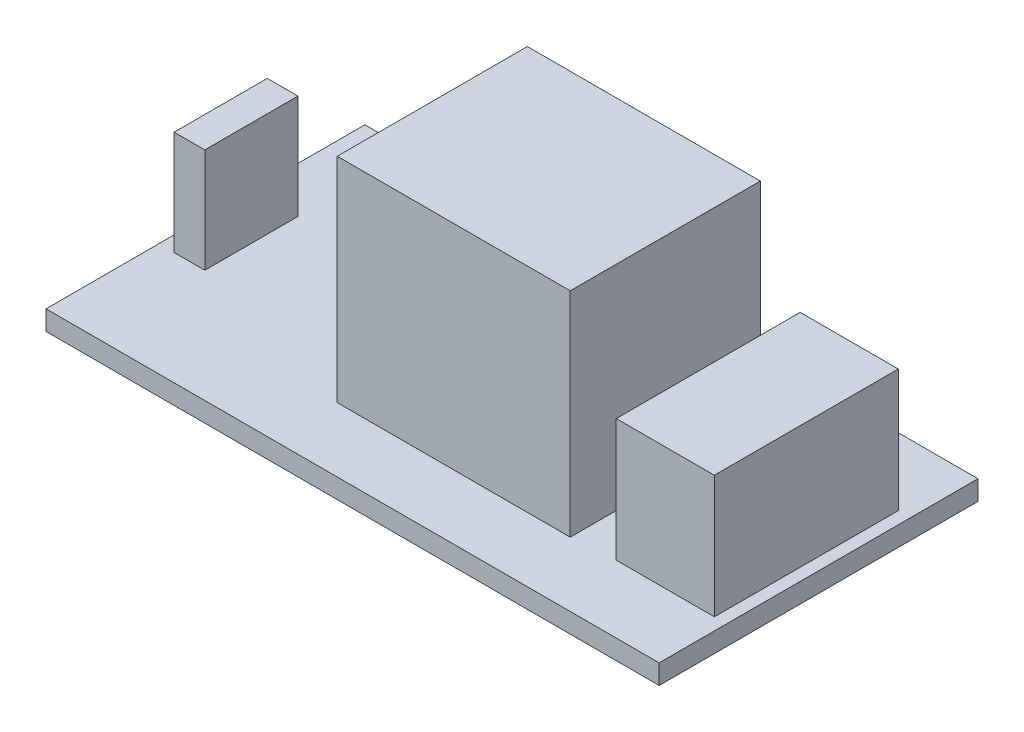
ISO-10303-21;
HEADER;
FILE_DESCRIPTION(('STEP AP214'),'2;1');
FILE_NAME('part.step','',(''),(''),'','','');
FILE_SCHEMA(('AUTOMOTIVE_DESIGN { 1 0 10303 214 1 1 1 1 }'));
ENDSEC;
DATA;
#1=APPLICATION_CONTEXT('core data for automotive mechanical design processes');
#2=APPLICATION_PROTOCOL_DEFINITION('international standard','automotive_design',2000,#1);
#3=PRODUCT_CONTEXT('',#1,'mechanical');
#4=PRODUCT('Part','Part','',(#3));
#5=PRODUCT_RELATED_PRODUCT_CATEGORY('part','',(#4));
#6=PRODUCT_DEFINITION_FORMATION('','',#4);
#7=PRODUCT_DEFINITION_CONTEXT('part definition',#1,'design');
#8=PRODUCT_DEFINITION('design','',#6,#7);
#9=PRODUCT_DEFINITION_SHAPE('','',#8);
#10=(LENGTH_UNIT() NAMED_UNIT(*) SI_UNIT(.MILLI.,.METRE.));
#11=(NAMED_UNIT(*) PLANE_ANGLE_UNIT() SI_UNIT($,.RADIAN.));
#12=(NAMED_UNIT(*) SI_UNIT($,.STERADIAN.) SOLID_ANGLE_UNIT());
#13=UNCERTAINTY_MEASURE_WITH_UNIT(LENGTH_MEASURE(1.E-05),#10,'distance_accuracy_value','');
#14=(GEOMETRIC_REPRESENTATION_CONTEXT(3) GLOBAL_UNCERTAINTY_ASSIGNED_CONTEXT((#13)) GLOBAL_UNIT_ASSIGNED_CONTEXT((#10,
#11,#12)) REPRESENTATION_CONTEXT('',''));
#15=CARTESIAN_POINT('',(0.,0.,0.));
#16=DIRECTION('',(0.,0.,1.));
#17=DIRECTION('',(1.,0.,0.));
#18=AXIS2_PLACEMENT_3D('',#15,#16,#17);
#19=CARTESIAN_POINT('',(0.,1.6,0.));
#20=DIRECTION('',(0.,-1.,0.));
#21=DIRECTION('',(0.,0.,-1.));
#22=AXIS2_PLACEMENT_3D('',#19,#20,#21);
#23=PLANE('',#22);
#24=DIRECTION('',(0.,0.,1.));
#25=VECTOR('',#24,1.);
#26=CARTESIAN_POINT('',(16.,1.6,-7.5));
#27=LINE('',#26,#25);
#28=CARTESIAN_POINT('',(16.,1.6,-7.5));
#29=VERTEX_POINT('',#28);
#30=CARTESIAN_POINT('',(16.,1.6,7.5));
#31=VERTEX_POINT('',#30);
#32=EDGE_CURVE('E182',#29,#31,#27,.T.);
#33=ORIENTED_EDGE('',*,*,#32,.F.);
#34=DIRECTION('',(-1.,0.,0.));
#35=VECTOR('',#34,1.);
#36=CARTESIAN_POINT('',(24.,1.6,-7.5));
#37=LINE('',#36,#35);
#38=CARTESIAN_POINT('',(24.,1.6,-7.5));
#39=VERTEX_POINT('',#38);
#40=EDGE_CURVE('E193',#39,#29,#37,.T.);
#41=ORIENTED_EDGE('',*,*,#40,.F.);
#42=DIRECTION('',(0.,0.,-1.));
#43=VECTOR('',#42,1.);
#44=CARTESIAN_POINT('',(24.,1.6,7.5));
#45=LINE('',#44,#43);
#46=CARTESIAN_POINT('',(24.,1.6,7.5));
#47=VERTEX_POINT('',#46);
#48=EDGE_CURVE('E201',#47,#39,#45,.T.);
#49=ORIENTED_EDGE('',*,*,#48,.F.);
#50=DIRECTION('',(1.,0.,0.));
#51=VECTOR('',#50,1.);
#52=CARTESIAN_POINT('',(16.,1.6,7.5));
#53=LINE('',#52,#51);
#54=EDGE_CURVE('E184',#31,#47,#53,.T.);
#55=ORIENTED_EDGE('',*,*,#54,.F.);
#56=EDGE_LOOP('',(#33,#41,#49,#55));
#57=FACE_BOUND('',#56,.T.);
#58=DIRECTION('',(0.,0.,-1.));
#59=VECTOR('',#58,1.);
#60=CARTESIAN_POINT('',(25.,1.6,13.));
#61=LINE('',#60,#59);
#62=CARTESIAN_POINT('',(25.,1.6,13.));
#63=VERTEX_POINT('',#62);
#64=CARTESIAN_POINT('',(25.,1.6,-13.));
#65=VERTEX_POINT('',#64);
#66=EDGE_CURVE('E251',#63,#65,#61,.T.);
#67=ORIENTED_EDGE('',*,*,#66,.T.);
#68=DIRECTION('',(-1.,0.,0.));
#69=VECTOR('',#68,1.);
#70=CARTESIAN_POINT('',(-25.,1.6,-13.));
#71=LINE('',#70,#69);
#72=CARTESIAN_POINT('',(-25.,1.6,-13.));
#73=VERTEX_POINT('',#72);
#74=EDGE_CURVE('E258',#65,#73,#71,.T.);
#75=ORIENTED_EDGE('',*,*,#74,.T.);
#76=DIRECTION('',(0.,0.,1.));
#77=VECTOR('',#76,1.);
#78=CARTESIAN_POINT('',(-25.,1.6,13.));
#79=LINE('',#78,#77);
#80=CARTESIAN_POINT('',(-25.,1.6,13.));
#81=VERTEX_POINT('',#80);
#82=EDGE_CURVE('E259',#73,#81,#79,.T.);
#83=ORIENTED_EDGE('',*,*,#82,.T.);
#84=DIRECTION('',(1.,0.,0.));
#85=VECTOR('',#84,1.);
#86=CARTESIAN_POINT('',(-25.,1.6,13.));
#87=LINE('',#86,#85);
#88=EDGE_CURVE('E261',#81,#63,#87,.T.);
#89=ORIENTED_EDGE('',*,*,#88,.T.);
#90=EDGE_LOOP('',(#67,#75,#83,#89));
#91=FACE_BOUND('',#90,.T.);
#92=DIRECTION('',(0.,0.,1.));
#93=VECTOR('',#92,1.);
#94=CARTESIAN_POINT('',(-6.5,1.6,-7.75));
#95=LINE('',#94,#93);
#96=CARTESIAN_POINT('',(-6.5,1.6,-7.75));
#97=VERTEX_POINT('',#96);
#98=CARTESIAN_POINT('',(-6.5,1.6,7.75));
#99=VERTEX_POINT('',#98);
#100=EDGE_CURVE('E218',#97,#99,#95,.T.);
#101=ORIENTED_EDGE('',*,*,#100,.F.);
#102=DIRECTION('',(-1.,0.,0.));
#103=VECTOR('',#102,1.);
#104=CARTESIAN_POINT('',(12.5,1.6,-7.75));
#105=LINE('',#104,#103);
#106=CARTESIAN_POINT('',(12.5,1.6,-7.75));
#107=VERTEX_POINT('',#106);
#108=EDGE_CURVE('E221',#107,#97,#105,.T.);
#109=ORIENTED_EDGE('',*,*,#108,.F.);
#110=DIRECTION('',(0.,0.,-1.));
#111=VECTOR('',#110,1.);
#112=CARTESIAN_POINT('',(12.5,1.6,7.75));
#113=LINE('',#112,#111);
#114=CARTESIAN_POINT('',(12.5,1.6,7.75));
#115=VERTEX_POINT('',#114);
#116=EDGE_CURVE('E237',#115,#107,#113,.T.);
#117=ORIENTED_EDGE('',*,*,#116,.F.);
#118=DIRECTION('',(1.,0.,0.));
#119=VECTOR('',#118,1.);
#120=CARTESIAN_POINT('',(-6.5,1.6,7.75));
#121=LINE('',#120,#119);
#122=EDGE_CURVE('E234',#99,#115,#121,.T.);
#123=ORIENTED_EDGE('',*,*,#122,.F.);
#124=EDGE_LOOP('',(#101,#109,#117,#123));
#125=FACE_BOUND('',#124,.T.);
#126=DIRECTION('',(0.,0.,1.));
#127=VECTOR('',#126,1.);
#128=CARTESIAN_POINT('',(-23.75,1.6,-3.8));
#129=LINE('',#128,#127);
#130=CARTESIAN_POINT('',(-23.75,1.6,-3.8));
#131=VERTEX_POINT('',#130);
#132=CARTESIAN_POINT('',(-23.75,1.6,3.8));
#133=VERTEX_POINT('',#132);
#134=EDGE_CURVE('E180',#131,#133,#129,.T.);
#135=ORIENTED_EDGE('',*,*,#134,.F.);
#136=DIRECTION('',(-1.,0.,0.));
#137=VECTOR('',#136,1.);
#138=CARTESIAN_POINT('',(-21.25,1.6,-3.8));
#139=LINE('',#138,#137);
#140=CARTESIAN_POINT('',(-21.25,1.6,-3.8));
#141=VERTEX_POINT('',#140);
#142=EDGE_CURVE('E177',#141,#131,#139,.T.);
#143=ORIENTED_EDGE('',*,*,#142,.F.);
#144=DIRECTION('',(0.,0.,-1.));
#145=VECTOR('',#144,1.);
#146=CARTESIAN_POINT('',(-21.25,1.6,3.8));
#147=LINE('',#146,#145);
#148=CARTESIAN_POINT('',(-21.25,1.6,3.8));
#149=VERTEX_POINT('',#148);
#150=EDGE_CURVE('E67',#149,#141,#147,.T.);
#151=ORIENTED_EDGE('',*,*,#150,.F.);
#152=DIRECTION('',(1.,0.,0.));
#153=VECTOR('',#152,1.);
#154=CARTESIAN_POINT('',(-23.75,1.6,3.8));
#155=LINE('',#154,#153);
#156=EDGE_CURVE('E65',#133,#149,#155,.T.);
#157=ORIENTED_EDGE('',*,*,#156,.F.);
#158=EDGE_LOOP('',(#135,#143,#151,#157));
#159=FACE_BOUND('',#158,.T.);
#160=ADVANCED_FACE('F50',(#57,#91,#125,#159),#23,.F.);
#161=CARTESIAN_POINT('',(25.,1.6,13.));
#162=DIRECTION('',(-1.,0.,0.));
#163=DIRECTION('',(0.,0.,1.));
#164=AXIS2_PLACEMENT_3D('',#161,#162,#163);
#165=PLANE('',#164);
#166=DIRECTION('',(0.,0.,-1.));
#167=VECTOR('',#166,1.);
#168=CARTESIAN_POINT('',(25.,0.,13.));
#169=LINE('',#168,#167);
#170=CARTESIAN_POINT('',(25.,0.,13.));
#171=VERTEX_POINT('',#170);
#172=CARTESIAN_POINT('',(25.,0.,-13.));
#173=VERTEX_POINT('',#172);
#174=EDGE_CURVE('E252',#171,#173,#169,.T.);
#175=ORIENTED_EDGE('',*,*,#174,.T.);
#176=DIRECTION('',(0.,-1.,0.));
#177=VECTOR('',#176,1.);
#178=CARTESIAN_POINT('',(25.,1.6,-13.));
#179=LINE('',#178,#177);
#180=EDGE_CURVE('E11',#65,#173,#179,.T.);
#181=ORIENTED_EDGE('',*,*,#180,.F.);
#182=ORIENTED_EDGE('',*,*,#66,.F.);
#183=DIRECTION('',(0.,-1.,0.));
#184=VECTOR('',#183,1.);
#185=CARTESIAN_POINT('',(25.,1.6,13.));
#186=LINE('',#185,#184);
#187=EDGE_CURVE('E263',#63,#171,#186,.T.);
#188=ORIENTED_EDGE('',*,*,#187,.T.);
#189=EDGE_LOOP('',(#175,#181,#182,#188));
#190=FACE_BOUND('',#189,.T.);
#191=ADVANCED_FACE('F47',(#190),#165,.F.);
#192=CARTESIAN_POINT('',(-25.,1.6,-13.));
#193=DIRECTION('',(0.,0.,1.));
#194=DIRECTION('',(1.,0.,0.));
#195=AXIS2_PLACEMENT_3D('',#192,#193,#194);
#196=PLANE('',#195);
#197=DIRECTION('',(-1.,0.,0.));
#198=VECTOR('',#197,1.);
#199=CARTESIAN_POINT('',(-25.,0.,-13.));
#200=LINE('',#199,#198);
#201=CARTESIAN_POINT('',(-25.,0.,-13.));
#202=VERTEX_POINT('',#201);
#203=EDGE_CURVE('E266',#173,#202,#200,.T.);
#204=ORIENTED_EDGE('',*,*,#203,.T.);
#205=DIRECTION('',(0.,-1.,0.));
#206=VECTOR('',#205,1.);
#207=CARTESIAN_POINT('',(-25.,1.6,-13.));
#208=LINE('',#207,#206);
#209=EDGE_CURVE('E54',#73,#202,#208,.T.);
#210=ORIENTED_EDGE('',*,*,#209,.F.);
#211=ORIENTED_EDGE('',*,*,#74,.F.);
#212=ORIENTED_EDGE('',*,*,#180,.T.);
#213=EDGE_LOOP('',(#204,#210,#211,#212));
#214=FACE_BOUND('',#213,.T.);
#215=ADVANCED_FACE('F298',(#214),#196,.F.);
#216=CARTESIAN_POINT('',(-25.,1.6,13.));
#217=DIRECTION('',(1.,0.,0.));
#218=DIRECTION('',(0.,0.,-1.));
#219=AXIS2_PLACEMENT_3D('',#216,#217,#218);
#220=PLANE('',#219);
#221=DIRECTION('',(0.,0.,1.));
#222=VECTOR('',#221,1.);
#223=CARTESIAN_POINT('',(-25.,0.,13.));
#224=LINE('',#223,#222);
#225=CARTESIAN_POINT('',(-25.,0.,13.));
#226=VERTEX_POINT('',#225);
#227=EDGE_CURVE('E268',#202,#226,#224,.T.);
#228=ORIENTED_EDGE('',*,*,#227,.T.);
#229=DIRECTION('',(0.,-1.,0.));
#230=VECTOR('',#229,1.);
#231=CARTESIAN_POINT('',(-25.,1.6,13.));
#232=LINE('',#231,#230);
#233=EDGE_CURVE('E272',#81,#226,#232,.T.);
#234=ORIENTED_EDGE('',*,*,#233,.F.);
#235=ORIENTED_EDGE('',*,*,#82,.F.);
#236=ORIENTED_EDGE('',*,*,#209,.T.);
#237=EDGE_LOOP('',(#228,#234,#235,#236));
#238=FACE_BOUND('',#237,.T.);
#239=ADVANCED_FACE('F278',(#238),#220,.F.);
#240=CARTESIAN_POINT('',(-25.,1.6,13.));
#241=DIRECTION('',(0.,0.,-1.));
#242=DIRECTION('',(-1.,0.,0.));
#243=AXIS2_PLACEMENT_3D('',#240,#241,#242);
#244=PLANE('',#243);
#245=DIRECTION('',(1.,0.,0.));
#246=VECTOR('',#245,1.);
#247=CARTESIAN_POINT('',(-25.,0.,13.));
#248=LINE('',#247,#246);
#249=EDGE_CURVE('E260',#226,#171,#248,.T.);
#250=ORIENTED_EDGE('',*,*,#249,.T.);
#251=ORIENTED_EDGE('',*,*,#187,.F.);
#252=ORIENTED_EDGE('',*,*,#88,.F.);
#253=ORIENTED_EDGE('',*,*,#233,.T.);
#254=EDGE_LOOP('',(#250,#251,#252,#253));
#255=FACE_BOUND('',#254,.T.);
#256=ADVANCED_FACE('F288',(#255),#244,.F.);
#257=CARTESIAN_POINT('',(0.,0.,0.));
#258=DIRECTION('',(0.,-1.,0.));
#259=DIRECTION('',(0.,0.,-1.));
#260=AXIS2_PLACEMENT_3D('',#257,#258,#259);
#261=PLANE('',#260);
#262=ORIENTED_EDGE('',*,*,#174,.F.);
#263=ORIENTED_EDGE('',*,*,#249,.F.);
#264=ORIENTED_EDGE('',*,*,#227,.F.);
#265=ORIENTED_EDGE('',*,*,#203,.F.);
#266=EDGE_LOOP('',(#262,#263,#264,#265));
#267=FACE_BOUND('',#266,.T.);
#268=ADVANCED_FACE('F286',(#267),#261,.T.);
#269=CARTESIAN_POINT('',(-6.5,19.,-7.75));
#270=DIRECTION('',(1.,0.,0.));
#271=DIRECTION('',(0.,0.,-1.));
#272=AXIS2_PLACEMENT_3D('',#269,#270,#271);
#273=PLANE('',#272);
#274=ORIENTED_EDGE('',*,*,#100,.T.);
#275=DIRECTION('',(0.,-1.,0.));
#276=VECTOR('',#275,1.);
#277=CARTESIAN_POINT('',(-6.5,19.,7.75));
#278=LINE('',#277,#276);
#279=CARTESIAN_POINT('',(-6.5,19.,7.75));
#280=VERTEX_POINT('',#279);
#281=EDGE_CURVE('E248',#280,#99,#278,.T.);
#282=ORIENTED_EDGE('',*,*,#281,.F.);
#283=DIRECTION('',(0.,0.,1.));
#284=VECTOR('',#283,1.);
#285=CARTESIAN_POINT('',(-6.5,19.,-7.75));
#286=LINE('',#285,#284);
#287=CARTESIAN_POINT('',(-6.5,19.,-7.75));
#288=VERTEX_POINT('',#287);
#289=EDGE_CURVE('E219',#288,#280,#286,.T.);
#290=ORIENTED_EDGE('',*,*,#289,.F.);
#291=DIRECTION('',(0.,-1.,0.));
#292=VECTOR('',#291,1.);
#293=CARTESIAN_POINT('',(-6.5,19.,-7.75));
#294=LINE('',#293,#292);
#295=EDGE_CURVE('E229',#288,#97,#294,.T.);
#296=ORIENTED_EDGE('',*,*,#295,.T.);
#297=EDGE_LOOP('',(#274,#282,#290,#296));
#298=FACE_BOUND('',#297,.T.);
#299=ADVANCED_FACE('F315',(#298),#273,.F.);
#300=CARTESIAN_POINT('',(-6.5,19.,7.75));
#301=DIRECTION('',(0.,0.,-1.));
#302=DIRECTION('',(-1.,0.,0.));
#303=AXIS2_PLACEMENT_3D('',#300,#301,#302);
#304=PLANE('',#303);
#305=ORIENTED_EDGE('',*,*,#122,.T.);
#306=DIRECTION('',(0.,-1.,0.));
#307=VECTOR('',#306,1.);
#308=CARTESIAN_POINT('',(12.5,19.,7.75));
#309=LINE('',#308,#307);
#310=CARTESIAN_POINT('',(12.5,19.,7.75));
#311=VERTEX_POINT('',#310);
#312=EDGE_CURVE('E246',#311,#115,#309,.T.);
#313=ORIENTED_EDGE('',*,*,#312,.F.);
#314=DIRECTION('',(1.,0.,0.));
#315=VECTOR('',#314,1.);
#316=CARTESIAN_POINT('',(-6.5,19.,7.75));
#317=LINE('',#316,#315);
#318=EDGE_CURVE('E224',#280,#311,#317,.T.);
#319=ORIENTED_EDGE('',*,*,#318,.F.);
#320=ORIENTED_EDGE('',*,*,#281,.T.);
#321=EDGE_LOOP('',(#305,#313,#319,#320));
#322=FACE_BOUND('',#321,.T.);
#323=ADVANCED_FACE('F333',(#322),#304,.F.);
#324=CARTESIAN_POINT('',(12.5,19.,7.75));
#325=DIRECTION('',(-1.,0.,0.));
#326=DIRECTION('',(0.,0.,1.));
#327=AXIS2_PLACEMENT_3D('',#324,#325,#326);
#328=PLANE('',#327);
#329=ORIENTED_EDGE('',*,*,#116,.T.);
#330=DIRECTION('',(0.,-1.,0.));
#331=VECTOR('',#330,1.);
#332=CARTESIAN_POINT('',(12.5,19.,-7.75));
#333=LINE('',#332,#331);
#334=CARTESIAN_POINT('',(12.5,19.,-7.75));
#335=VERTEX_POINT('',#334);
#336=EDGE_CURVE('E241',#335,#107,#333,.T.);
#337=ORIENTED_EDGE('',*,*,#336,.F.);
#338=DIRECTION('',(0.,0.,-1.));
#339=VECTOR('',#338,1.);
#340=CARTESIAN_POINT('',(12.5,19.,7.75));
#341=LINE('',#340,#339);
#342=EDGE_CURVE('E228',#311,#335,#341,.T.);
#343=ORIENTED_EDGE('',*,*,#342,.F.);
#344=ORIENTED_EDGE('',*,*,#312,.T.);
#345=EDGE_LOOP('',(#329,#337,#343,#344));
#346=FACE_BOUND('',#345,.T.);
#347=ADVANCED_FACE('F347',(#346),#328,.F.);
#348=CARTESIAN_POINT('',(12.5,19.,-7.75));
#349=DIRECTION('',(0.,0.,1.));
#350=DIRECTION('',(1.,0.,0.));
#351=AXIS2_PLACEMENT_3D('',#348,#349,#350);
#352=PLANE('',#351);
#353=ORIENTED_EDGE('',*,*,#108,.T.);
#354=ORIENTED_EDGE('',*,*,#295,.F.);
#355=DIRECTION('',(-1.,0.,0.));
#356=VECTOR('',#355,1.);
#357=CARTESIAN_POINT('',(12.5,19.,-7.75));
#358=LINE('',#357,#356);
#359=EDGE_CURVE('E226',#335,#288,#358,.T.);
#360=ORIENTED_EDGE('',*,*,#359,.F.);
#361=ORIENTED_EDGE('',*,*,#336,.T.);
#362=EDGE_LOOP('',(#353,#354,#360,#361));
#363=FACE_BOUND('',#362,.T.);
#364=ADVANCED_FACE('F357',(#363),#352,.F.);
#365=CARTESIAN_POINT('',(0.,19.,0.));
#366=DIRECTION('',(0.,1.,0.));
#367=DIRECTION('',(0.,0.,1.));
#368=AXIS2_PLACEMENT_3D('',#365,#366,#367);
#369=PLANE('',#368);
#370=ORIENTED_EDGE('',*,*,#289,.T.);
#371=ORIENTED_EDGE('',*,*,#318,.T.);
#372=ORIENTED_EDGE('',*,*,#342,.T.);
#373=ORIENTED_EDGE('',*,*,#359,.T.);
#374=EDGE_LOOP('',(#370,#371,#372,#373));
#375=FACE_BOUND('',#374,.T.);
#376=ADVANCED_FACE('F369',(#375),#369,.T.);
#377=CARTESIAN_POINT('',(16.,11.6,-7.5));
#378=DIRECTION('',(1.,0.,0.));
#379=DIRECTION('',(0.,0.,-1.));
#380=AXIS2_PLACEMENT_3D('',#377,#378,#379);
#381=PLANE('',#380);
#382=ORIENTED_EDGE('',*,*,#32,.T.);
#383=DIRECTION('',(0.,-1.,0.));
#384=VECTOR('',#383,1.);
#385=CARTESIAN_POINT('',(16.,11.6,7.5));
#386=LINE('',#385,#384);
#387=CARTESIAN_POINT('',(16.,11.6,7.5));
#388=VERTEX_POINT('',#387);
#389=EDGE_CURVE('E216',#388,#31,#386,.T.);
#390=ORIENTED_EDGE('',*,*,#389,.F.);
#391=DIRECTION('',(0.,0.,1.));
#392=VECTOR('',#391,1.);
#393=CARTESIAN_POINT('',(16.,11.6,-7.5));
#394=LINE('',#393,#392);
#395=CARTESIAN_POINT('',(16.,11.6,-7.5));
#396=VERTEX_POINT('',#395);
#397=EDGE_CURVE('E189',#396,#388,#394,.T.);
#398=ORIENTED_EDGE('',*,*,#397,.F.);
#399=DIRECTION('',(0.,-1.,0.));
#400=VECTOR('',#399,1.);
#401=CARTESIAN_POINT('',(16.,11.6,-7.5));
#402=LINE('',#401,#400);
#403=EDGE_CURVE('E200',#396,#29,#402,.T.);
#404=ORIENTED_EDGE('',*,*,#403,.T.);
#405=EDGE_LOOP('',(#382,#390,#398,#404));
#406=FACE_BOUND('',#405,.T.);
#407=ADVANCED_FACE('F381',(#406),#381,.F.);
#408=CARTESIAN_POINT('',(16.,11.6,7.5));
#409=DIRECTION('',(0.,0.,-1.));
#410=DIRECTION('',(-1.,0.,0.));
#411=AXIS2_PLACEMENT_3D('',#408,#409,#410);
#412=PLANE('',#411);
#413=ORIENTED_EDGE('',*,*,#54,.T.);
#414=DIRECTION('',(0.,-1.,0.));
#415=VECTOR('',#414,1.);
#416=CARTESIAN_POINT('',(24.,11.6,7.5));
#417=LINE('',#416,#415);
#418=CARTESIAN_POINT('',(24.,11.6,7.5));
#419=VERTEX_POINT('',#418);
#420=EDGE_CURVE('E213',#419,#47,#417,.T.);
#421=ORIENTED_EDGE('',*,*,#420,.F.);
#422=DIRECTION('',(1.,0.,0.));
#423=VECTOR('',#422,1.);
#424=CARTESIAN_POINT('',(16.,11.6,7.5));
#425=LINE('',#424,#423);
#426=EDGE_CURVE('E194',#388,#419,#425,.T.);
#427=ORIENTED_EDGE('',*,*,#426,.F.);
#428=ORIENTED_EDGE('',*,*,#389,.T.);
#429=EDGE_LOOP('',(#413,#421,#427,#428));
#430=FACE_BOUND('',#429,.T.);
#431=ADVANCED_FACE('F391',(#430),#412,.F.);
#432=CARTESIAN_POINT('',(24.,11.6,7.5));
#433=DIRECTION('',(-1.,0.,0.));
#434=DIRECTION('',(0.,0.,1.));
#435=AXIS2_PLACEMENT_3D('',#432,#433,#434);
#436=PLANE('',#435);
#437=ORIENTED_EDGE('',*,*,#48,.T.);
#438=DIRECTION('',(0.,-1.,0.));
#439=VECTOR('',#438,1.);
#440=CARTESIAN_POINT('',(24.,11.6,-7.5));
#441=LINE('',#440,#439);
#442=CARTESIAN_POINT('',(24.,11.6,-7.5));
#443=VERTEX_POINT('',#442);
#444=EDGE_CURVE('E209',#443,#39,#441,.T.);
#445=ORIENTED_EDGE('',*,*,#444,.F.);
#446=DIRECTION('',(0.,0.,-1.));
#447=VECTOR('',#446,1.);
#448=CARTESIAN_POINT('',(24.,11.6,7.5));
#449=LINE('',#448,#447);
#450=EDGE_CURVE('E198',#419,#443,#449,.T.);
#451=ORIENTED_EDGE('',*,*,#450,.F.);
#452=ORIENTED_EDGE('',*,*,#420,.T.);
#453=EDGE_LOOP('',(#437,#445,#451,#452));
#454=FACE_BOUND('',#453,.T.);
#455=ADVANCED_FACE('F403',(#454),#436,.F.);
#456=CARTESIAN_POINT('',(24.,11.6,-7.5));
#457=DIRECTION('',(0.,0.,1.));
#458=DIRECTION('',(1.,0.,0.));
#459=AXIS2_PLACEMENT_3D('',#456,#457,#458);
#460=PLANE('',#459);
#461=ORIENTED_EDGE('',*,*,#40,.T.);
#462=ORIENTED_EDGE('',*,*,#403,.F.);
#463=DIRECTION('',(-1.,0.,0.));
#464=VECTOR('',#463,1.);
#465=CARTESIAN_POINT('',(24.,11.6,-7.5));
#466=LINE('',#465,#464);
#467=EDGE_CURVE('E196',#443,#396,#466,.T.);
#468=ORIENTED_EDGE('',*,*,#467,.F.);
#469=ORIENTED_EDGE('',*,*,#444,.T.);
#470=EDGE_LOOP('',(#461,#462,#468,#469));
#471=FACE_BOUND('',#470,.T.);
#472=ADVANCED_FACE('F417',(#471),#460,.F.);
#473=CARTESIAN_POINT('',(0.,11.6,0.));
#474=DIRECTION('',(0.,1.,0.));
#475=DIRECTION('',(0.,0.,1.));
#476=AXIS2_PLACEMENT_3D('',#473,#474,#475);
#477=PLANE('',#476);
#478=ORIENTED_EDGE('',*,*,#397,.T.);
#479=ORIENTED_EDGE('',*,*,#426,.T.);
#480=ORIENTED_EDGE('',*,*,#450,.T.);
#481=ORIENTED_EDGE('',*,*,#467,.T.);
#482=EDGE_LOOP('',(#478,#479,#480,#481));
#483=FACE_BOUND('',#482,.T.);
#484=ADVANCED_FACE('F428',(#483),#477,.T.);
#485=CARTESIAN_POINT('',(-23.75,10.1,-3.8));
#486=DIRECTION('',(1.,0.,0.));
#487=DIRECTION('',(0.,0.,-1.));
#488=AXIS2_PLACEMENT_3D('',#485,#486,#487);
#489=PLANE('',#488);
#490=ORIENTED_EDGE('',*,*,#134,.T.);
#491=DIRECTION('',(0.,-1.,0.));
#492=VECTOR('',#491,1.);
#493=CARTESIAN_POINT('',(-23.75,10.1,3.8));
#494=LINE('',#493,#492);
#495=CARTESIAN_POINT('',(-23.75,10.1,3.8));
#496=VERTEX_POINT('',#495);
#497=EDGE_CURVE('E161',#496,#133,#494,.T.);
#498=ORIENTED_EDGE('',*,*,#497,.F.);
#499=DIRECTION('',(0.,0.,1.));
#500=VECTOR('',#499,1.);
#501=CARTESIAN_POINT('',(-23.75,10.1,-3.8));
#502=LINE('',#501,#500);
#503=CARTESIAN_POINT('',(-23.75,10.1,-3.8));
#504=VERTEX_POINT('',#503);
#505=EDGE_CURVE('E169',#504,#496,#502,.T.);
#506=ORIENTED_EDGE('',*,*,#505,.F.);
#507=DIRECTION('',(0.,-1.,0.));
#508=VECTOR('',#507,1.);
#509=CARTESIAN_POINT('',(-23.75,10.1,-3.8));
#510=LINE('',#509,#508);
#511=EDGE_CURVE('E541',#504,#131,#510,.T.);
#512=ORIENTED_EDGE('',*,*,#511,.T.);
#513=EDGE_LOOP('',(#490,#498,#506,#512));
#514=FACE_BOUND('',#513,.T.);
#515=ADVANCED_FACE('F178',(#514),#489,.F.);
#516=CARTESIAN_POINT('',(-23.75,10.1,3.8));
#517=DIRECTION('',(0.,0.,-1.));
#518=DIRECTION('',(-1.,0.,0.));
#519=AXIS2_PLACEMENT_3D('',#516,#517,#518);
#520=PLANE('',#519);
#521=ORIENTED_EDGE('',*,*,#156,.T.);
#522=DIRECTION('',(0.,-1.,0.));
#523=VECTOR('',#522,1.);
#524=CARTESIAN_POINT('',(-21.25,10.1,3.8));
#525=LINE('',#524,#523);
#526=CARTESIAN_POINT('',(-21.25,10.1,3.8));
#527=VERTEX_POINT('',#526);
#528=EDGE_CURVE('E163',#527,#149,#525,.T.);
#529=ORIENTED_EDGE('',*,*,#528,.F.);
#530=DIRECTION('',(1.,0.,0.));
#531=VECTOR('',#530,1.);
#532=CARTESIAN_POINT('',(-23.75,10.1,3.8));
#533=LINE('',#532,#531);
#534=EDGE_CURVE('E160',#496,#527,#533,.T.);
#535=ORIENTED_EDGE('',*,*,#534,.F.);
#536=ORIENTED_EDGE('',*,*,#497,.T.);
#537=EDGE_LOOP('',(#521,#529,#535,#536));
#538=FACE_BOUND('',#537,.T.);
#539=ADVANCED_FACE('F157',(#538),#520,.F.);
#540=CARTESIAN_POINT('',(-21.25,10.1,3.8));
#541=DIRECTION('',(-1.,0.,0.));
#542=DIRECTION('',(0.,0.,1.));
#543=AXIS2_PLACEMENT_3D('',#540,#541,#542);
#544=PLANE('',#543);
#545=ORIENTED_EDGE('',*,*,#150,.T.);
#546=DIRECTION('',(0.,-1.,0.));
#547=VECTOR('',#546,1.);
#548=CARTESIAN_POINT('',(-21.25,10.1,-3.8));
#549=LINE('',#548,#547);
#550=CARTESIAN_POINT('',(-21.25,10.1,-3.8));
#551=VERTEX_POINT('',#550);
#552=EDGE_CURVE('E188',#551,#141,#549,.T.);
#553=ORIENTED_EDGE('',*,*,#552,.F.);
#554=DIRECTION('',(0.,0.,-1.));
#555=VECTOR('',#554,1.);
#556=CARTESIAN_POINT('',(-21.25,10.1,3.8));
#557=LINE('',#556,#555);
#558=EDGE_CURVE('E170',#527,#551,#557,.T.);
#559=ORIENTED_EDGE('',*,*,#558,.F.);
#560=ORIENTED_EDGE('',*,*,#528,.T.);
#561=EDGE_LOOP('',(#545,#553,#559,#560));
#562=FACE_BOUND('',#561,.T.);
#563=ADVANCED_FACE('F459',(#562),#544,.F.);
#564=CARTESIAN_POINT('',(-21.25,10.1,-3.8));
#565=DIRECTION('',(0.,0.,1.));
#566=DIRECTION('',(1.,0.,0.));
#567=AXIS2_PLACEMENT_3D('',#564,#565,#566);
#568=PLANE('',#567);
#569=ORIENTED_EDGE('',*,*,#142,.T.);
#570=ORIENTED_EDGE('',*,*,#511,.F.);
#571=DIRECTION('',(-1.,0.,0.));
#572=VECTOR('',#571,1.);
#573=CARTESIAN_POINT('',(-21.25,10.1,-3.8));
#574=LINE('',#573,#572);
#575=EDGE_CURVE('E171',#551,#504,#574,.T.);
#576=ORIENTED_EDGE('',*,*,#575,.F.);
#577=ORIENTED_EDGE('',*,*,#552,.T.);
#578=EDGE_LOOP('',(#569,#570,#576,#577));
#579=FACE_BOUND('',#578,.T.);
#580=ADVANCED_FACE('F469',(#579),#568,.F.);
#581=CARTESIAN_POINT('',(0.,10.1,0.));
#582=DIRECTION('',(0.,1.,0.));
#583=DIRECTION('',(0.,0.,1.));
#584=AXIS2_PLACEMENT_3D('',#581,#582,#583);
#585=PLANE('',#584);
#586=ORIENTED_EDGE('',*,*,#505,.T.);
#587=ORIENTED_EDGE('',*,*,#534,.T.);
#588=ORIENTED_EDGE('',*,*,#558,.T.);
#589=ORIENTED_EDGE('',*,*,#575,.T.);
#590=EDGE_LOOP('',(#586,#587,#588,#589));
#591=FACE_BOUND('',#590,.T.);
#592=ADVANCED_FACE('F173',(#591),#585,.T.);
#593=CLOSED_SHELL('',(#160,#191,#215,#239,#256,#268,#299,#323,#347,#364,#376,#407,#431,#455,
#472,#484,#515,#539,#563,#580,#592));
#594=MANIFOLD_SOLID_BREP('B2',#593);
#595=ADVANCED_BREP_SHAPE_REPRESENTATION('',(#18,#594),#14);
#596=SHAPE_DEFINITION_REPRESENTATION(#9,#595);
ENDSEC;
END-ISO-10303-21;
